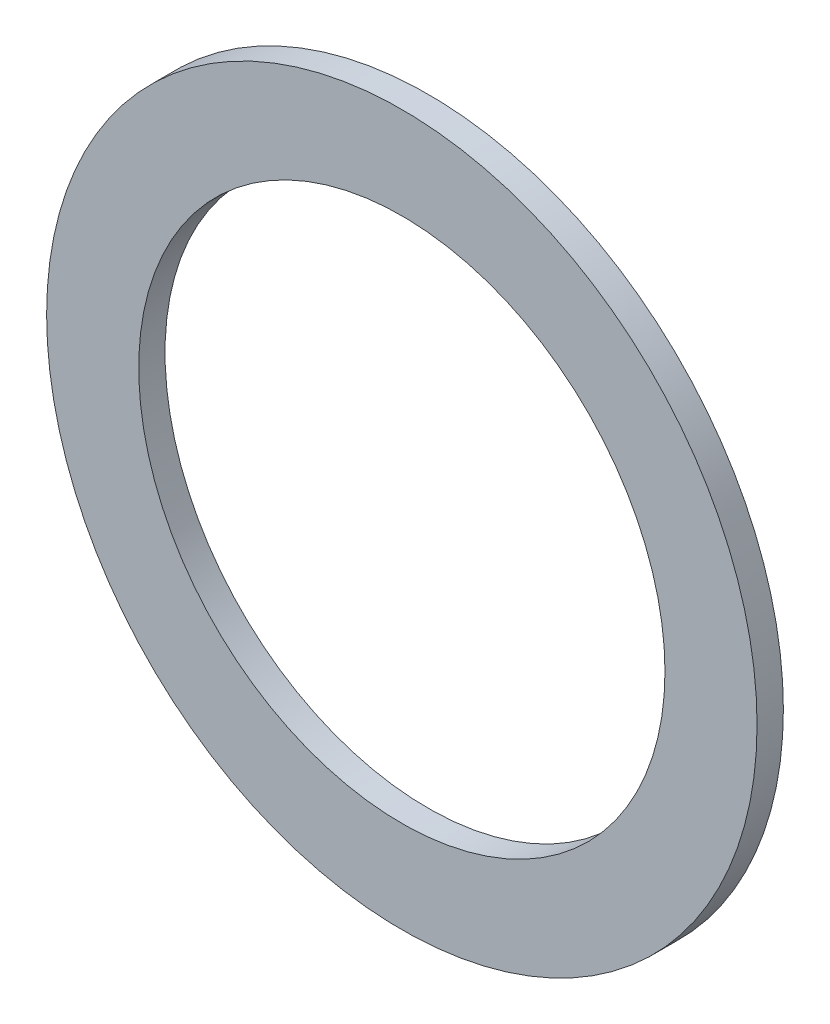
ISO-10303-21;
HEADER;
FILE_DESCRIPTION(('STEP AP214'),'2;1');
FILE_NAME('part.step','',(''),(''),'','','');
FILE_SCHEMA(('AUTOMOTIVE_DESIGN { 1 0 10303 214 1 1 1 1 }'));
ENDSEC;
DATA;
#1=APPLICATION_CONTEXT('core data for automotive mechanical design processes');
#2=APPLICATION_PROTOCOL_DEFINITION('international standard','automotive_design',2000,#1);
#3=PRODUCT_CONTEXT('',#1,'mechanical');
#4=PRODUCT('Part','Part','',(#3));
#5=PRODUCT_RELATED_PRODUCT_CATEGORY('part','',(#4));
#6=PRODUCT_DEFINITION_FORMATION('','',#4);
#7=PRODUCT_DEFINITION_CONTEXT('part definition',#1,'design');
#8=PRODUCT_DEFINITION('design','',#6,#7);
#9=PRODUCT_DEFINITION_SHAPE('','',#8);
#10=(LENGTH_UNIT() NAMED_UNIT(*) SI_UNIT(.MILLI.,.METRE.));
#11=(NAMED_UNIT(*) PLANE_ANGLE_UNIT() SI_UNIT($,.RADIAN.));
#12=(NAMED_UNIT(*) SI_UNIT($,.STERADIAN.) SOLID_ANGLE_UNIT());
#13=UNCERTAINTY_MEASURE_WITH_UNIT(LENGTH_MEASURE(1.E-05),#10,'distance_accuracy_value','');
#14=(GEOMETRIC_REPRESENTATION_CONTEXT(3) GLOBAL_UNCERTAINTY_ASSIGNED_CONTEXT((#13)) GLOBAL_UNIT_ASSIGNED_CONTEXT((#10,
#11,#12)) REPRESENTATION_CONTEXT('',''));
#15=CARTESIAN_POINT('',(0.,0.,0.));
#16=DIRECTION('',(0.,0.,1.));
#17=DIRECTION('',(1.,0.,0.));
#18=AXIS2_PLACEMENT_3D('',#15,#16,#17);
#19=CARTESIAN_POINT('',(0.,0.,1.));
#20=DIRECTION('',(0.,0.,1.));
#21=DIRECTION('',(1.,0.,0.));
#22=AXIS2_PLACEMENT_3D('',#19,#20,#21);
#23=PLANE('',#22);
#24=CARTESIAN_POINT('',(0.,0.,1.));
#25=DIRECTION('',(0.,0.,1.));
#26=DIRECTION('',(1.,0.,0.));
#27=AXIS2_PLACEMENT_3D('',#24,#25,#26);
#28=CIRCLE('',#27,13.5);
#29=CARTESIAN_POINT('',(13.5,0.,1.));
#30=VERTEX_POINT('',#29);
#31=EDGE_CURVE('E10',#30,#30,#28,.T.);
#32=ORIENTED_EDGE('',*,*,#31,.T.);
#33=EDGE_LOOP('',(#32));
#34=FACE_BOUND('',#33,.T.);
#35=CARTESIAN_POINT('',(0.,0.,1.));
#36=DIRECTION('',(0.,0.,1.));
#37=DIRECTION('',(1.,0.,0.));
#38=AXIS2_PLACEMENT_3D('',#35,#36,#37);
#39=CIRCLE('',#38,10.);
#40=CARTESIAN_POINT('',(10.,0.,1.));
#41=VERTEX_POINT('',#40);
#42=EDGE_CURVE('E41',#41,#41,#39,.T.);
#43=ORIENTED_EDGE('',*,*,#42,.F.);
#44=EDGE_LOOP('',(#43));
#45=FACE_BOUND('',#44,.T.);
#46=ADVANCED_FACE('F30',(#34,#45),#23,.T.);
#47=CARTESIAN_POINT('',(0.,0.,0.));
#48=DIRECTION('',(0.,0.,1.));
#49=DIRECTION('',(1.,0.,0.));
#50=AXIS2_PLACEMENT_3D('',#47,#48,#49);
#51=PLANE('',#50);
#52=CARTESIAN_POINT('',(0.,0.,0.));
#53=DIRECTION('',(0.,0.,1.));
#54=DIRECTION('',(1.,0.,0.));
#55=AXIS2_PLACEMENT_3D('',#52,#53,#54);
#56=CIRCLE('',#55,13.5);
#57=CARTESIAN_POINT('',(13.5,0.,0.));
#58=VERTEX_POINT('',#57);
#59=EDGE_CURVE('E34',#58,#58,#56,.T.);
#60=ORIENTED_EDGE('',*,*,#59,.F.);
#61=EDGE_LOOP('',(#60));
#62=FACE_BOUND('',#61,.T.);
#63=CARTESIAN_POINT('',(0.,0.,0.));
#64=DIRECTION('',(0.,0.,1.));
#65=DIRECTION('',(1.,0.,0.));
#66=AXIS2_PLACEMENT_3D('',#63,#64,#65);
#67=CIRCLE('',#66,10.);
#68=CARTESIAN_POINT('',(10.,0.,0.));
#69=VERTEX_POINT('',#68);
#70=EDGE_CURVE('E43',#69,#69,#67,.T.);
#71=ORIENTED_EDGE('',*,*,#70,.T.);
#72=EDGE_LOOP('',(#71));
#73=FACE_BOUND('',#72,.T.);
#74=ADVANCED_FACE('F53',(#62,#73),#51,.F.);
#75=CARTESIAN_POINT('',(0.,0.,1.));
#76=DIRECTION('',(0.,0.,-1.));
#77=DIRECTION('',(-1.,0.,0.));
#78=AXIS2_PLACEMENT_3D('',#75,#76,#77);
#79=CYLINDRICAL_SURFACE('',#78,13.5);
#80=ORIENTED_EDGE('',*,*,#31,.F.);
#81=EDGE_LOOP('',(#80));
#82=FACE_BOUND('',#81,.T.);
#83=ORIENTED_EDGE('',*,*,#59,.T.);
#84=EDGE_LOOP('',(#83));
#85=FACE_BOUND('',#84,.T.);
#86=ADVANCED_FACE('F32',(#82,#85),#79,.T.);
#87=CARTESIAN_POINT('',(0.,0.,1.));
#88=DIRECTION('',(0.,0.,-1.));
#89=DIRECTION('',(-1.,0.,0.));
#90=AXIS2_PLACEMENT_3D('',#87,#88,#89);
#91=CYLINDRICAL_SURFACE('',#90,10.);
#92=ORIENTED_EDGE('',*,*,#42,.T.);
#93=EDGE_LOOP('',(#92));
#94=FACE_BOUND('',#93,.T.);
#95=ORIENTED_EDGE('',*,*,#70,.F.);
#96=EDGE_LOOP('',(#95));
#97=FACE_BOUND('',#96,.T.);
#98=ADVANCED_FACE('F49',(#94,#97),#91,.F.);
#99=CLOSED_SHELL('',(#46,#74,#86,#98));
#100=MANIFOLD_SOLID_BREP('B2',#99);
#101=ADVANCED_BREP_SHAPE_REPRESENTATION('',(#18,#100),#14);
#102=SHAPE_DEFINITION_REPRESENTATION(#9,#101);
ENDSEC;
END-ISO-10303-21;
